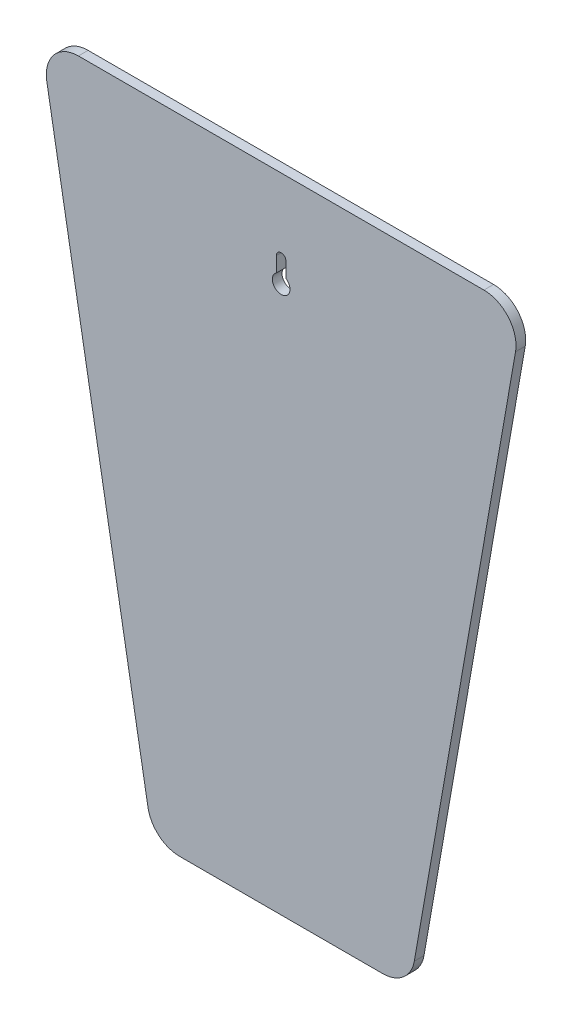
ISO-10303-21;
HEADER;
FILE_DESCRIPTION(('STEP AP214'),'2;1');
FILE_NAME('part.step','',(''),(''),'','','');
FILE_SCHEMA(('AUTOMOTIVE_DESIGN { 1 0 10303 214 1 1 1 1 }'));
ENDSEC;
DATA;
#1=APPLICATION_CONTEXT('core data for automotive mechanical design processes');
#2=APPLICATION_PROTOCOL_DEFINITION('international standard','automotive_design',2000,#1);
#3=PRODUCT_CONTEXT('',#1,'mechanical');
#4=PRODUCT('Part','Part','',(#3));
#5=PRODUCT_RELATED_PRODUCT_CATEGORY('part','',(#4));
#6=PRODUCT_DEFINITION_FORMATION('','',#4);
#7=PRODUCT_DEFINITION_CONTEXT('part definition',#1,'design');
#8=PRODUCT_DEFINITION('design','',#6,#7);
#9=PRODUCT_DEFINITION_SHAPE('','',#8);
#10=(LENGTH_UNIT() NAMED_UNIT(*) SI_UNIT(.MILLI.,.METRE.));
#11=(NAMED_UNIT(*) PLANE_ANGLE_UNIT() SI_UNIT($,.RADIAN.));
#12=(NAMED_UNIT(*) SI_UNIT($,.STERADIAN.) SOLID_ANGLE_UNIT());
#13=UNCERTAINTY_MEASURE_WITH_UNIT(LENGTH_MEASURE(1.E-05),#10,'distance_accuracy_value','');
#14=(GEOMETRIC_REPRESENTATION_CONTEXT(3) GLOBAL_UNCERTAINTY_ASSIGNED_CONTEXT((#13)) GLOBAL_UNIT_ASSIGNED_CONTEXT((#10,
#11,#12)) REPRESENTATION_CONTEXT('',''));
#15=CARTESIAN_POINT('',(0.,0.,0.));
#16=DIRECTION('',(0.,0.,1.));
#17=DIRECTION('',(1.,0.,0.));
#18=AXIS2_PLACEMENT_3D('',#15,#16,#17);
#19=CARTESIAN_POINT('',(0.,0.,-0.01));
#20=DIRECTION('',(0.,0.,1.));
#21=DIRECTION('',(1.,0.,0.));
#22=AXIS2_PLACEMENT_3D('',#19,#20,#21);
#23=PLANE('',#22);
#24=DIRECTION('',(0.172380331752248,-0.985030467155704,0.));
#25=VECTOR('',#24,1.);
#26=CARTESIAN_POINT('',(-75.,200.,-0.01));
#27=LINE('',#26,#25);
#28=CARTESIAN_POINT('',(-72.9483344194336,188.276196682478,-0.01));
#29=VERTEX_POINT('',#28);
#30=CARTESIAN_POINT('',(-41.4483344194336,8.27619668247756,-0.01));
#31=VERTEX_POINT('',#30);
#32=EDGE_CURVE('E194',#29,#31,#27,.T.);
#33=ORIENTED_EDGE('',*,*,#32,.F.);
#34=CARTESIAN_POINT('',(-63.0980297478765,190.,-0.01));
#35=DIRECTION('',(0.,0.,1.));
#36=DIRECTION('',(1.,0.,0.));
#37=AXIS2_PLACEMENT_3D('',#34,#35,#36);
#38=CIRCLE('',#37,10.);
#39=CARTESIAN_POINT('',(-63.0980297478765,200.,-0.01));
#40=VERTEX_POINT('',#39);
#41=EDGE_CURVE('E11',#29,#40,#38,.F.);
#42=ORIENTED_EDGE('',*,*,#41,.T.);
#43=DIRECTION('',(-1.,0.,0.));
#44=VECTOR('',#43,1.);
#45=CARTESIAN_POINT('',(-75.,200.,-0.01));
#46=LINE('',#45,#44);
#47=CARTESIAN_POINT('',(63.0980297478765,200.,-0.01));
#48=VERTEX_POINT('',#47);
#49=EDGE_CURVE('E190',#48,#40,#46,.T.);
#50=ORIENTED_EDGE('',*,*,#49,.F.);
#51=CARTESIAN_POINT('',(63.0980297478765,190.,-0.01));
#52=DIRECTION('',(0.,0.,1.));
#53=DIRECTION('',(1.,0.,0.));
#54=AXIS2_PLACEMENT_3D('',#51,#52,#53);
#55=CIRCLE('',#54,10.);
#56=CARTESIAN_POINT('',(72.9483344194336,188.276196682478,-0.01));
#57=VERTEX_POINT('',#56);
#58=EDGE_CURVE('E211',#48,#57,#55,.F.);
#59=ORIENTED_EDGE('',*,*,#58,.T.);
#60=DIRECTION('',(0.172380331752248,0.985030467155704,0.));
#61=VECTOR('',#60,1.);
#62=CARTESIAN_POINT('',(75.,200.,-0.01));
#63=LINE('',#62,#61);
#64=CARTESIAN_POINT('',(41.4483344194336,8.2761966824775,-0.01));
#65=VERTEX_POINT('',#64);
#66=EDGE_CURVE('E187',#65,#57,#63,.T.);
#67=ORIENTED_EDGE('',*,*,#66,.F.);
#68=CARTESIAN_POINT('',(31.5980297478765,10.,-0.01));
#69=DIRECTION('',(0.,0.,1.));
#70=DIRECTION('',(1.,0.,0.));
#71=AXIS2_PLACEMENT_3D('',#68,#69,#70);
#72=CIRCLE('',#71,10.);
#73=CARTESIAN_POINT('',(31.5980297478765,0.,-0.01));
#74=VERTEX_POINT('',#73);
#75=EDGE_CURVE('E226',#65,#74,#72,.F.);
#76=ORIENTED_EDGE('',*,*,#75,.T.);
#77=DIRECTION('',(1.,0.,0.));
#78=VECTOR('',#77,1.);
#79=CARTESIAN_POINT('',(-40.,0.,-0.01));
#80=LINE('',#79,#78);
#81=CARTESIAN_POINT('',(-31.5980297478765,0.,-0.01));
#82=VERTEX_POINT('',#81);
#83=EDGE_CURVE('E197',#82,#74,#80,.T.);
#84=ORIENTED_EDGE('',*,*,#83,.F.);
#85=CARTESIAN_POINT('',(-31.5980297478765,10.,-0.01));
#86=DIRECTION('',(0.,0.,1.));
#87=DIRECTION('',(1.,0.,0.));
#88=AXIS2_PLACEMENT_3D('',#85,#86,#87);
#89=CIRCLE('',#88,10.);
#90=EDGE_CURVE('E241',#82,#31,#89,.F.);
#91=ORIENTED_EDGE('',*,*,#90,.T.);
#92=EDGE_LOOP('',(#33,#42,#50,#59,#67,#76,#84,#91));
#93=FACE_BOUND('',#92,.T.);
#94=DIRECTION('',(0.,1.,0.));
#95=VECTOR('',#94,1.);
#96=CARTESIAN_POINT('',(-1.49999999999995,0.,-0.01));
#97=LINE('',#96,#95);
#98=CARTESIAN_POINT('',(-1.5,172.304886114323,-0.00999999999999959));
#99=VERTEX_POINT('',#98);
#100=CARTESIAN_POINT('',(-1.5,177.,-0.00999999999999959));
#101=VERTEX_POINT('',#100);
#102=EDGE_CURVE('E171',#99,#101,#97,.T.);
#103=ORIENTED_EDGE('',*,*,#102,.F.);
#104=CARTESIAN_POINT('',(0.,170.,-0.00999999999999959));
#105=DIRECTION('',(0.,0.,1.));
#106=DIRECTION('',(1.,0.,0.));
#107=AXIS2_PLACEMENT_3D('',#104,#105,#106);
#108=CIRCLE('',#107,2.75000000000001);
#109=CARTESIAN_POINT('',(1.50000000000001,172.304886114323,-0.00999999999999959));
#110=VERTEX_POINT('',#109);
#111=EDGE_CURVE('E158',#99,#110,#108,.T.);
#112=ORIENTED_EDGE('',*,*,#111,.T.);
#113=DIRECTION('',(0.,1.,0.));
#114=VECTOR('',#113,1.);
#115=CARTESIAN_POINT('',(1.50000000000004,0.,-0.01));
#116=LINE('',#115,#114);
#117=CARTESIAN_POINT('',(1.5,177.,-0.00999999999999959));
#118=VERTEX_POINT('',#117);
#119=EDGE_CURVE('E134',#110,#118,#116,.T.);
#120=ORIENTED_EDGE('',*,*,#119,.T.);
#121=CARTESIAN_POINT('',(0.,177.,-0.00999999999999959));
#122=DIRECTION('',(0.,0.,1.));
#123=DIRECTION('',(1.,0.,0.));
#124=AXIS2_PLACEMENT_3D('',#121,#122,#123);
#125=CIRCLE('',#124,1.5);
#126=EDGE_CURVE('E167',#118,#101,#125,.T.);
#127=ORIENTED_EDGE('',*,*,#126,.T.);
#128=EDGE_LOOP('',(#103,#112,#120,#127));
#129=FACE_BOUND('',#128,.T.);
#130=ADVANCED_FACE('F39',(#93,#129),#23,.F.);
#131=CARTESIAN_POINT('',(0.,0.,3.));
#132=DIRECTION('',(0.,0.,1.));
#133=DIRECTION('',(1.,0.,0.));
#134=AXIS2_PLACEMENT_3D('',#131,#132,#133);
#135=PLANE('',#134);
#136=DIRECTION('',(-1.,0.,0.));
#137=VECTOR('',#136,1.);
#138=CARTESIAN_POINT('',(-75.,200.,3.));
#139=LINE('',#138,#137);
#140=CARTESIAN_POINT('',(63.0980297478765,200.,3.));
#141=VERTEX_POINT('',#140);
#142=CARTESIAN_POINT('',(-63.0980297478765,200.,3.));
#143=VERTEX_POINT('',#142);
#144=EDGE_CURVE('E177',#141,#143,#139,.T.);
#145=ORIENTED_EDGE('',*,*,#144,.T.);
#146=CARTESIAN_POINT('',(-63.0980297478765,190.,3.));
#147=DIRECTION('',(0.,0.,1.));
#148=DIRECTION('',(1.,0.,0.));
#149=AXIS2_PLACEMENT_3D('',#146,#147,#148);
#150=CIRCLE('',#149,10.);
#151=CARTESIAN_POINT('',(-72.9483344194336,188.276196682478,3.));
#152=VERTEX_POINT('',#151);
#153=EDGE_CURVE('E48',#143,#152,#150,.T.);
#154=ORIENTED_EDGE('',*,*,#153,.T.);
#155=DIRECTION('',(0.172380331752248,-0.985030467155704,0.));
#156=VECTOR('',#155,1.);
#157=CARTESIAN_POINT('',(-75.,200.,3.));
#158=LINE('',#157,#156);
#159=CARTESIAN_POINT('',(-41.4483344194336,8.27619668247756,3.));
#160=VERTEX_POINT('',#159);
#161=EDGE_CURVE('E181',#152,#160,#158,.T.);
#162=ORIENTED_EDGE('',*,*,#161,.T.);
#163=CARTESIAN_POINT('',(-31.5980297478765,10.,3.));
#164=DIRECTION('',(0.,0.,1.));
#165=DIRECTION('',(1.,0.,0.));
#166=AXIS2_PLACEMENT_3D('',#163,#164,#165);
#167=CIRCLE('',#166,10.);
#168=CARTESIAN_POINT('',(-31.5980297478765,0.,3.));
#169=VERTEX_POINT('',#168);
#170=EDGE_CURVE('E238',#160,#169,#167,.T.);
#171=ORIENTED_EDGE('',*,*,#170,.T.);
#172=DIRECTION('',(1.,0.,0.));
#173=VECTOR('',#172,1.);
#174=CARTESIAN_POINT('',(-40.,0.,3.));
#175=LINE('',#174,#173);
#176=CARTESIAN_POINT('',(31.5980297478765,0.,3.));
#177=VERTEX_POINT('',#176);
#178=EDGE_CURVE('E184',#169,#177,#175,.T.);
#179=ORIENTED_EDGE('',*,*,#178,.T.);
#180=CARTESIAN_POINT('',(31.5980297478765,10.,3.));
#181=DIRECTION('',(0.,0.,1.));
#182=DIRECTION('',(1.,0.,0.));
#183=AXIS2_PLACEMENT_3D('',#180,#181,#182);
#184=CIRCLE('',#183,10.);
#185=CARTESIAN_POINT('',(41.4483344194336,8.2761966824775,3.));
#186=VERTEX_POINT('',#185);
#187=EDGE_CURVE('E223',#177,#186,#184,.T.);
#188=ORIENTED_EDGE('',*,*,#187,.T.);
#189=DIRECTION('',(0.172380331752248,0.985030467155704,0.));
#190=VECTOR('',#189,1.);
#191=CARTESIAN_POINT('',(75.,200.,3.));
#192=LINE('',#191,#190);
#193=CARTESIAN_POINT('',(72.9483344194336,188.276196682478,3.));
#194=VERTEX_POINT('',#193);
#195=EDGE_CURVE('E174',#186,#194,#192,.T.);
#196=ORIENTED_EDGE('',*,*,#195,.T.);
#197=CARTESIAN_POINT('',(63.0980297478765,190.,3.));
#198=DIRECTION('',(0.,0.,1.));
#199=DIRECTION('',(1.,0.,0.));
#200=AXIS2_PLACEMENT_3D('',#197,#198,#199);
#201=CIRCLE('',#200,10.);
#202=EDGE_CURVE('E208',#194,#141,#201,.T.);
#203=ORIENTED_EDGE('',*,*,#202,.T.);
#204=EDGE_LOOP('',(#145,#154,#162,#171,#179,#188,#196,#203));
#205=FACE_BOUND('',#204,.T.);
#206=CARTESIAN_POINT('',(0.,170.,3.));
#207=DIRECTION('',(0.,0.,1.));
#208=DIRECTION('',(1.,0.,0.));
#209=AXIS2_PLACEMENT_3D('',#206,#207,#208);
#210=CIRCLE('',#209,2.75000000000001);
#211=CARTESIAN_POINT('',(-1.5,172.304886114323,3.));
#212=VERTEX_POINT('',#211);
#213=CARTESIAN_POINT('',(1.5,172.304886114323,3.));
#214=VERTEX_POINT('',#213);
#215=EDGE_CURVE('E141',#212,#214,#210,.T.);
#216=ORIENTED_EDGE('',*,*,#215,.F.);
#217=DIRECTION('',(0.,1.,0.));
#218=VECTOR('',#217,1.);
#219=CARTESIAN_POINT('',(-1.49999999999995,0.,3.));
#220=LINE('',#219,#218);
#221=CARTESIAN_POINT('',(-1.5,177.,3.));
#222=VERTEX_POINT('',#221);
#223=EDGE_CURVE('E63',#212,#222,#220,.T.);
#224=ORIENTED_EDGE('',*,*,#223,.T.);
#225=CARTESIAN_POINT('',(0.,177.,3.));
#226=DIRECTION('',(0.,0.,1.));
#227=DIRECTION('',(1.,0.,0.));
#228=AXIS2_PLACEMENT_3D('',#225,#226,#227);
#229=CIRCLE('',#228,1.5);
#230=CARTESIAN_POINT('',(1.5,177.,3.));
#231=VERTEX_POINT('',#230);
#232=EDGE_CURVE('E148',#231,#222,#229,.T.);
#233=ORIENTED_EDGE('',*,*,#232,.F.);
#234=DIRECTION('',(0.,1.,0.));
#235=VECTOR('',#234,1.);
#236=CARTESIAN_POINT('',(1.50000000000004,0.,3.));
#237=LINE('',#236,#235);
#238=EDGE_CURVE('E131',#214,#231,#237,.T.);
#239=ORIENTED_EDGE('',*,*,#238,.F.);
#240=EDGE_LOOP('',(#216,#224,#233,#239));
#241=FACE_BOUND('',#240,.T.);
#242=ADVANCED_FACE('F146',(#205,#241),#135,.T.);
#243=CARTESIAN_POINT('',(-63.0980297478765,190.,-0.01));
#244=DIRECTION('',(0.,0.,-1.));
#245=DIRECTION('',(-1.,0.,0.));
#246=AXIS2_PLACEMENT_3D('',#243,#244,#245);
#247=CYLINDRICAL_SURFACE('',#246,10.);
#248=DIRECTION('',(0.,0.,-1.));
#249=VECTOR('',#248,1.);
#250=CARTESIAN_POINT('',(-72.9483344194336,188.276196682478,-0.01));
#251=LINE('',#250,#249);
#252=EDGE_CURVE('E245',#152,#29,#251,.T.);
#253=ORIENTED_EDGE('',*,*,#252,.F.);
#254=ORIENTED_EDGE('',*,*,#153,.F.);
#255=DIRECTION('',(0.,0.,-1.));
#256=VECTOR('',#255,1.);
#257=CARTESIAN_POINT('',(-63.0980297478765,200.,-0.01));
#258=LINE('',#257,#256);
#259=EDGE_CURVE('E249',#40,#143,#258,.F.);
#260=ORIENTED_EDGE('',*,*,#259,.F.);
#261=ORIENTED_EDGE('',*,*,#41,.F.);
#262=EDGE_LOOP('',(#253,#254,#260,#261));
#263=FACE_BOUND('',#262,.T.);
#264=ADVANCED_FACE('F41',(#263),#247,.T.);
#265=CARTESIAN_POINT('',(-31.5980297478765,10.,-0.01));
#266=DIRECTION('',(0.,0.,-1.));
#267=DIRECTION('',(-1.,0.,0.));
#268=AXIS2_PLACEMENT_3D('',#265,#266,#267);
#269=CYLINDRICAL_SURFACE('',#268,10.);
#270=DIRECTION('',(0.,0.,-1.));
#271=VECTOR('',#270,1.);
#272=CARTESIAN_POINT('',(-31.5980297478765,0.,-0.01));
#273=LINE('',#272,#271);
#274=EDGE_CURVE('E230',#169,#82,#273,.T.);
#275=ORIENTED_EDGE('',*,*,#274,.F.);
#276=ORIENTED_EDGE('',*,*,#170,.F.);
#277=DIRECTION('',(0.,0.,-1.));
#278=VECTOR('',#277,1.);
#279=CARTESIAN_POINT('',(-41.4483344194336,8.2761966824775,-0.01));
#280=LINE('',#279,#278);
#281=EDGE_CURVE('E234',#31,#160,#280,.F.);
#282=ORIENTED_EDGE('',*,*,#281,.F.);
#283=ORIENTED_EDGE('',*,*,#90,.F.);
#284=EDGE_LOOP('',(#275,#276,#282,#283));
#285=FACE_BOUND('',#284,.T.);
#286=ADVANCED_FACE('F266',(#285),#269,.T.);
#287=CARTESIAN_POINT('',(31.5980297478765,10.,-0.01));
#288=DIRECTION('',(0.,0.,-1.));
#289=DIRECTION('',(-1.,0.,0.));
#290=AXIS2_PLACEMENT_3D('',#287,#288,#289);
#291=CYLINDRICAL_SURFACE('',#290,10.);
#292=DIRECTION('',(0.,0.,-1.));
#293=VECTOR('',#292,1.);
#294=CARTESIAN_POINT('',(41.4483344194336,8.2761966824775,-0.01));
#295=LINE('',#294,#293);
#296=EDGE_CURVE('E215',#186,#65,#295,.T.);
#297=ORIENTED_EDGE('',*,*,#296,.F.);
#298=ORIENTED_EDGE('',*,*,#187,.F.);
#299=DIRECTION('',(0.,0.,-1.));
#300=VECTOR('',#299,1.);
#301=CARTESIAN_POINT('',(31.5980297478765,0.,-0.01));
#302=LINE('',#301,#300);
#303=EDGE_CURVE('E219',#74,#177,#302,.F.);
#304=ORIENTED_EDGE('',*,*,#303,.F.);
#305=ORIENTED_EDGE('',*,*,#75,.F.);
#306=EDGE_LOOP('',(#297,#298,#304,#305));
#307=FACE_BOUND('',#306,.T.);
#308=ADVANCED_FACE('F273',(#307),#291,.T.);
#309=CARTESIAN_POINT('',(63.0980297478765,190.,-0.01));
#310=DIRECTION('',(0.,0.,-1.));
#311=DIRECTION('',(-1.,0.,0.));
#312=AXIS2_PLACEMENT_3D('',#309,#310,#311);
#313=CYLINDRICAL_SURFACE('',#312,10.);
#314=DIRECTION('',(0.,0.,-1.));
#315=VECTOR('',#314,1.);
#316=CARTESIAN_POINT('',(63.0980297478765,200.,-0.01));
#317=LINE('',#316,#315);
#318=EDGE_CURVE('E200',#141,#48,#317,.T.);
#319=ORIENTED_EDGE('',*,*,#318,.F.);
#320=ORIENTED_EDGE('',*,*,#202,.F.);
#321=DIRECTION('',(0.,0.,-1.));
#322=VECTOR('',#321,1.);
#323=CARTESIAN_POINT('',(72.9483344194336,188.276196682478,-0.01));
#324=LINE('',#323,#322);
#325=EDGE_CURVE('E204',#57,#194,#324,.F.);
#326=ORIENTED_EDGE('',*,*,#325,.F.);
#327=ORIENTED_EDGE('',*,*,#58,.F.);
#328=EDGE_LOOP('',(#319,#320,#326,#327));
#329=FACE_BOUND('',#328,.T.);
#330=ADVANCED_FACE('F286',(#329),#313,.T.);
#331=CARTESIAN_POINT('',(75.,200.,-0.01));
#332=DIRECTION('',(0.985030467155704,-0.172380331752248,0.));
#333=DIRECTION('',(0.172380331752248,0.985030467155704,0.));
#334=AXIS2_PLACEMENT_3D('',#331,#332,#333);
#335=PLANE('',#334);
#336=ORIENTED_EDGE('',*,*,#195,.F.);
#337=ORIENTED_EDGE('',*,*,#296,.T.);
#338=ORIENTED_EDGE('',*,*,#66,.T.);
#339=ORIENTED_EDGE('',*,*,#325,.T.);
#340=EDGE_LOOP('',(#336,#337,#338,#339));
#341=FACE_BOUND('',#340,.T.);
#342=ADVANCED_FACE('F281',(#341),#335,.T.);
#343=CARTESIAN_POINT('',(-40.,0.,-0.01));
#344=DIRECTION('',(0.,-1.,0.));
#345=DIRECTION('',(0.,0.,-1.));
#346=AXIS2_PLACEMENT_3D('',#343,#344,#345);
#347=PLANE('',#346);
#348=ORIENTED_EDGE('',*,*,#178,.F.);
#349=ORIENTED_EDGE('',*,*,#274,.T.);
#350=ORIENTED_EDGE('',*,*,#83,.T.);
#351=ORIENTED_EDGE('',*,*,#303,.T.);
#352=EDGE_LOOP('',(#348,#349,#350,#351));
#353=FACE_BOUND('',#352,.T.);
#354=ADVANCED_FACE('F275',(#353),#347,.T.);
#355=CARTESIAN_POINT('',(-75.,200.,-0.01));
#356=DIRECTION('',(-0.985030467155704,-0.172380331752248,0.));
#357=DIRECTION('',(0.172380331752248,-0.985030467155704,0.));
#358=AXIS2_PLACEMENT_3D('',#355,#356,#357);
#359=PLANE('',#358);
#360=ORIENTED_EDGE('',*,*,#161,.F.);
#361=ORIENTED_EDGE('',*,*,#252,.T.);
#362=ORIENTED_EDGE('',*,*,#32,.T.);
#363=ORIENTED_EDGE('',*,*,#281,.T.);
#364=EDGE_LOOP('',(#360,#361,#362,#363));
#365=FACE_BOUND('',#364,.T.);
#366=ADVANCED_FACE('F262',(#365),#359,.T.);
#367=CARTESIAN_POINT('',(-75.,200.,-0.01));
#368=DIRECTION('',(0.,1.,0.));
#369=DIRECTION('',(-1.,0.,0.));
#370=AXIS2_PLACEMENT_3D('',#367,#368,#369);
#371=PLANE('',#370);
#372=ORIENTED_EDGE('',*,*,#49,.T.);
#373=ORIENTED_EDGE('',*,*,#259,.T.);
#374=ORIENTED_EDGE('',*,*,#144,.F.);
#375=ORIENTED_EDGE('',*,*,#318,.T.);
#376=EDGE_LOOP('',(#372,#373,#374,#375));
#377=FACE_BOUND('',#376,.T.);
#378=ADVANCED_FACE('F289',(#377),#371,.T.);
#379=CARTESIAN_POINT('',(-1.49999999999995,0.,-7.));
#380=DIRECTION('',(1.,0.,0.));
#381=DIRECTION('',(0.,1.,0.));
#382=AXIS2_PLACEMENT_3D('',#379,#380,#381);
#383=PLANE('',#382);
#384=ORIENTED_EDGE('',*,*,#102,.T.);
#385=DIRECTION('',(0.,0.,1.));
#386=VECTOR('',#385,1.);
#387=CARTESIAN_POINT('',(-1.5,177.,-7.));
#388=LINE('',#387,#386);
#389=EDGE_CURVE('E155',#101,#222,#388,.T.);
#390=ORIENTED_EDGE('',*,*,#389,.T.);
#391=ORIENTED_EDGE('',*,*,#223,.F.);
#392=DIRECTION('',(0.,0.,1.));
#393=VECTOR('',#392,1.);
#394=CARTESIAN_POINT('',(-1.5,172.304886114323,-7.));
#395=LINE('',#394,#393);
#396=EDGE_CURVE('E138',#99,#212,#395,.T.);
#397=ORIENTED_EDGE('',*,*,#396,.F.);
#398=EDGE_LOOP('',(#384,#390,#391,#397));
#399=FACE_BOUND('',#398,.T.);
#400=ADVANCED_FACE('F291',(#399),#383,.T.);
#401=CARTESIAN_POINT('',(0.,177.,-7.));
#402=DIRECTION('',(0.,0.,1.));
#403=DIRECTION('',(1.,0.,0.));
#404=AXIS2_PLACEMENT_3D('',#401,#402,#403);
#405=CYLINDRICAL_SURFACE('',#404,1.5);
#406=DIRECTION('',(0.,0.,1.));
#407=VECTOR('',#406,1.);
#408=CARTESIAN_POINT('',(1.5,177.,-7.));
#409=LINE('',#408,#407);
#410=EDGE_CURVE('E137',#118,#231,#409,.T.);
#411=ORIENTED_EDGE('',*,*,#410,.T.);
#412=ORIENTED_EDGE('',*,*,#232,.T.);
#413=ORIENTED_EDGE('',*,*,#389,.F.);
#414=ORIENTED_EDGE('',*,*,#126,.F.);
#415=EDGE_LOOP('',(#411,#412,#413,#414));
#416=FACE_BOUND('',#415,.T.);
#417=ADVANCED_FACE('F297',(#416),#405,.F.);
#418=CARTESIAN_POINT('',(1.50000000000004,0.,-7.));
#419=DIRECTION('',(1.,0.,0.));
#420=DIRECTION('',(0.,1.,0.));
#421=AXIS2_PLACEMENT_3D('',#418,#419,#420);
#422=PLANE('',#421);
#423=DIRECTION('',(0.,0.,1.));
#424=VECTOR('',#423,1.);
#425=CARTESIAN_POINT('',(1.5,172.304886114323,-7.));
#426=LINE('',#425,#424);
#427=EDGE_CURVE('E55',#110,#214,#426,.T.);
#428=ORIENTED_EDGE('',*,*,#427,.T.);
#429=ORIENTED_EDGE('',*,*,#238,.T.);
#430=ORIENTED_EDGE('',*,*,#410,.F.);
#431=ORIENTED_EDGE('',*,*,#119,.F.);
#432=EDGE_LOOP('',(#428,#429,#430,#431));
#433=FACE_BOUND('',#432,.T.);
#434=ADVANCED_FACE('F128',(#433),#422,.F.);
#435=CARTESIAN_POINT('',(0.,170.,-7.));
#436=DIRECTION('',(0.,0.,1.));
#437=DIRECTION('',(1.,0.,0.));
#438=AXIS2_PLACEMENT_3D('',#435,#436,#437);
#439=CYLINDRICAL_SURFACE('',#438,2.75000000000001);
#440=ORIENTED_EDGE('',*,*,#396,.T.);
#441=ORIENTED_EDGE('',*,*,#215,.T.);
#442=ORIENTED_EDGE('',*,*,#427,.F.);
#443=ORIENTED_EDGE('',*,*,#111,.F.);
#444=EDGE_LOOP('',(#440,#441,#442,#443));
#445=FACE_BOUND('',#444,.T.);
#446=ADVANCED_FACE('F142',(#445),#439,.F.);
#447=CLOSED_SHELL('',(#130,#242,#264,#286,#308,#330,#342,#354,#366,#378,#400,#417,#434,#446));
#448=MANIFOLD_SOLID_BREP('B2',#447);
#449=ADVANCED_BREP_SHAPE_REPRESENTATION('',(#18,#448),#14);
#450=SHAPE_DEFINITION_REPRESENTATION(#9,#449);
ENDSEC;
END-ISO-10303-21;
